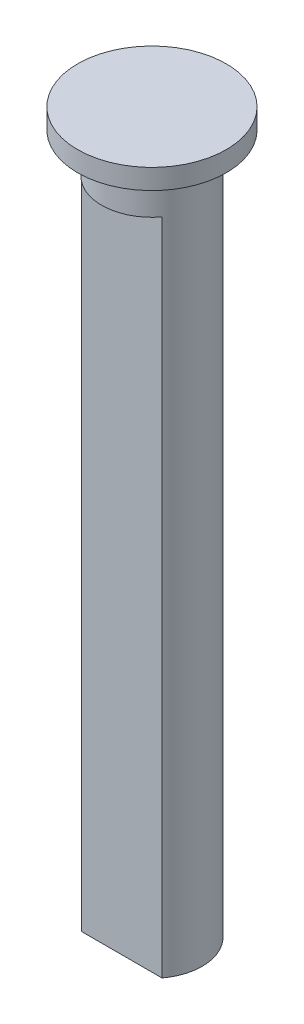
ISO-10303-21;
HEADER;
FILE_DESCRIPTION(('STEP AP214'),'2;1');
FILE_NAME('part.step','',(''),(''),'','','');
FILE_SCHEMA(('AUTOMOTIVE_DESIGN { 1 0 10303 214 1 1 1 1 }'));
ENDSEC;
DATA;
#1=APPLICATION_CONTEXT('core data for automotive mechanical design processes');
#2=APPLICATION_PROTOCOL_DEFINITION('international standard','automotive_design',2000,#1);
#3=PRODUCT_CONTEXT('',#1,'mechanical');
#4=PRODUCT('Part','Part','',(#3));
#5=PRODUCT_RELATED_PRODUCT_CATEGORY('part','',(#4));
#6=PRODUCT_DEFINITION_FORMATION('','',#4);
#7=PRODUCT_DEFINITION_CONTEXT('part definition',#1,'design');
#8=PRODUCT_DEFINITION('design','',#6,#7);
#9=PRODUCT_DEFINITION_SHAPE('','',#8);
#10=(LENGTH_UNIT() NAMED_UNIT(*) SI_UNIT(.MILLI.,.METRE.));
#11=(NAMED_UNIT(*) PLANE_ANGLE_UNIT() SI_UNIT($,.RADIAN.));
#12=(NAMED_UNIT(*) SI_UNIT($,.STERADIAN.) SOLID_ANGLE_UNIT());
#13=UNCERTAINTY_MEASURE_WITH_UNIT(LENGTH_MEASURE(1.E-05),#10,'distance_accuracy_value','');
#14=(GEOMETRIC_REPRESENTATION_CONTEXT(3) GLOBAL_UNCERTAINTY_ASSIGNED_CONTEXT((#13)) GLOBAL_UNIT_ASSIGNED_CONTEXT((#10,
#11,#12)) REPRESENTATION_CONTEXT('',''));
#15=CARTESIAN_POINT('',(0.,0.,0.));
#16=DIRECTION('',(0.,0.,1.));
#17=DIRECTION('',(1.,0.,0.));
#18=AXIS2_PLACEMENT_3D('',#15,#16,#17);
#19=CARTESIAN_POINT('',(0.,27.8,0.));
#20=DIRECTION('',(0.,-1.,0.));
#21=DIRECTION('',(0.,0.,-1.));
#22=AXIS2_PLACEMENT_3D('',#19,#20,#21);
#23=CYLINDRICAL_SURFACE('',#22,2.5);
#24=DIRECTION('',(0.,-1.,0.));
#25=VECTOR('',#24,1.);
#26=CARTESIAN_POINT('',(2.,27.8,1.5));
#27=LINE('',#26,#25);
#28=CARTESIAN_POINT('',(2.,27.8,1.5));
#29=VERTEX_POINT('',#28);
#30=CARTESIAN_POINT('',(2.,-5.,1.5));
#31=VERTEX_POINT('',#30);
#32=EDGE_CURVE('E42',#29,#31,#27,.T.);
#33=ORIENTED_EDGE('',*,*,#32,.T.);
#34=CARTESIAN_POINT('',(0.,-5.,0.));
#35=DIRECTION('',(0.,-1.,0.));
#36=DIRECTION('',(0.,0.,-1.));
#37=AXIS2_PLACEMENT_3D('',#34,#35,#36);
#38=CIRCLE('',#37,2.5);
#39=CARTESIAN_POINT('',(-2.,-5.,1.5));
#40=VERTEX_POINT('',#39);
#41=EDGE_CURVE('E61',#40,#31,#38,.T.);
#42=ORIENTED_EDGE('',*,*,#41,.F.);
#43=DIRECTION('',(0.,-1.,0.));
#44=VECTOR('',#43,1.);
#45=CARTESIAN_POINT('',(-2.,27.8,1.5));
#46=LINE('',#45,#44);
#47=CARTESIAN_POINT('',(-2.,27.8,1.5));
#48=VERTEX_POINT('',#47);
#49=EDGE_CURVE('E11',#48,#40,#46,.T.);
#50=ORIENTED_EDGE('',*,*,#49,.F.);
#51=CARTESIAN_POINT('',(0.,27.8,0.));
#52=DIRECTION('',(0.,1.,0.));
#53=DIRECTION('',(0.,0.,1.));
#54=AXIS2_PLACEMENT_3D('',#51,#52,#53);
#55=CIRCLE('',#54,2.5);
#56=EDGE_CURVE('E63',#48,#29,#55,.T.);
#57=ORIENTED_EDGE('',*,*,#56,.T.);
#58=EDGE_LOOP('',(#33,#42,#50,#57));
#59=FACE_BOUND('',#58,.T.);
#60=CARTESIAN_POINT('',(0.,29.8,0.));
#61=DIRECTION('',(0.,1.,0.));
#62=DIRECTION('',(0.,0.,1.));
#63=AXIS2_PLACEMENT_3D('',#60,#61,#62);
#64=CIRCLE('',#63,2.5);
#65=CARTESIAN_POINT('',(0.,29.8,2.5));
#66=VERTEX_POINT('',#65);
#67=EDGE_CURVE('E78',#66,#66,#64,.T.);
#68=ORIENTED_EDGE('',*,*,#67,.F.);
#69=EDGE_LOOP('',(#68));
#70=FACE_BOUND('',#69,.T.);
#71=ADVANCED_FACE('F35',(#59,#70),#23,.T.);
#72=CARTESIAN_POINT('',(-2.,27.8,1.5));
#73=DIRECTION('',(0.,0.,-1.));
#74=DIRECTION('',(-1.,0.,0.));
#75=AXIS2_PLACEMENT_3D('',#72,#73,#74);
#76=PLANE('',#75);
#77=ORIENTED_EDGE('',*,*,#49,.T.);
#78=DIRECTION('',(-1.,0.,0.));
#79=VECTOR('',#78,1.);
#80=CARTESIAN_POINT('',(-2.,-5.,1.5));
#81=LINE('',#80,#79);
#82=EDGE_CURVE('E65',#31,#40,#81,.T.);
#83=ORIENTED_EDGE('',*,*,#82,.F.);
#84=ORIENTED_EDGE('',*,*,#32,.F.);
#85=DIRECTION('',(1.,0.,0.));
#86=VECTOR('',#85,1.);
#87=CARTESIAN_POINT('',(-2.,27.8,1.5));
#88=LINE('',#87,#86);
#89=EDGE_CURVE('E48',#48,#29,#88,.T.);
#90=ORIENTED_EDGE('',*,*,#89,.F.);
#91=EDGE_LOOP('',(#77,#83,#84,#90));
#92=FACE_BOUND('',#91,.T.);
#93=ADVANCED_FACE('F66',(#92),#76,.F.);
#94=CARTESIAN_POINT('',(0.,27.8,0.));
#95=DIRECTION('',(0.,1.,0.));
#96=DIRECTION('',(0.,0.,1.));
#97=AXIS2_PLACEMENT_3D('',#94,#95,#96);
#98=PLANE('',#97);
#99=ORIENTED_EDGE('',*,*,#56,.F.);
#100=ORIENTED_EDGE('',*,*,#89,.T.);
#101=EDGE_LOOP('',(#99,#100));
#102=FACE_BOUND('',#101,.T.);
#103=ADVANCED_FACE('F83',(#102),#98,.F.);
#104=CARTESIAN_POINT('',(0.,30.8,0.));
#105=DIRECTION('',(0.,-1.,0.));
#106=DIRECTION('',(0.,0.,-1.));
#107=AXIS2_PLACEMENT_3D('',#104,#105,#106);
#108=CYLINDRICAL_SURFACE('',#107,3.7);
#109=CARTESIAN_POINT('',(0.,30.8,0.));
#110=DIRECTION('',(0.,1.,0.));
#111=DIRECTION('',(0.,0.,1.));
#112=AXIS2_PLACEMENT_3D('',#109,#110,#111);
#113=CIRCLE('',#112,3.7);
#114=CARTESIAN_POINT('',(0.,30.8,3.7));
#115=VERTEX_POINT('',#114);
#116=EDGE_CURVE('E73',#115,#115,#113,.T.);
#117=ORIENTED_EDGE('',*,*,#116,.F.);
#118=EDGE_LOOP('',(#117));
#119=FACE_BOUND('',#118,.T.);
#120=CARTESIAN_POINT('',(0.,29.8,0.));
#121=DIRECTION('',(0.,1.,0.));
#122=DIRECTION('',(0.,0.,1.));
#123=AXIS2_PLACEMENT_3D('',#120,#121,#122);
#124=CIRCLE('',#123,3.7);
#125=CARTESIAN_POINT('',(0.,29.8,3.7));
#126=VERTEX_POINT('',#125);
#127=EDGE_CURVE('E68',#126,#126,#124,.T.);
#128=ORIENTED_EDGE('',*,*,#127,.T.);
#129=EDGE_LOOP('',(#128));
#130=FACE_BOUND('',#129,.T.);
#131=ADVANCED_FACE('F85',(#119,#130),#108,.T.);
#132=CARTESIAN_POINT('',(0.,30.8,0.));
#133=DIRECTION('',(0.,1.,0.));
#134=DIRECTION('',(0.,0.,1.));
#135=AXIS2_PLACEMENT_3D('',#132,#133,#134);
#136=PLANE('',#135);
#137=ORIENTED_EDGE('',*,*,#116,.T.);
#138=EDGE_LOOP('',(#137));
#139=FACE_BOUND('',#138,.T.);
#140=ADVANCED_FACE('F91',(#139),#136,.T.);
#141=CARTESIAN_POINT('',(0.,29.8,0.));
#142=DIRECTION('',(0.,1.,0.));
#143=DIRECTION('',(0.,0.,1.));
#144=AXIS2_PLACEMENT_3D('',#141,#142,#143);
#145=PLANE('',#144);
#146=ORIENTED_EDGE('',*,*,#67,.T.);
#147=EDGE_LOOP('',(#146));
#148=FACE_BOUND('',#147,.T.);
#149=ORIENTED_EDGE('',*,*,#127,.F.);
#150=EDGE_LOOP('',(#149));
#151=FACE_BOUND('',#150,.T.);
#152=ADVANCED_FACE('F111',(#148,#151),#145,.F.);
#153=CARTESIAN_POINT('',(0.,-5.,0.));
#154=DIRECTION('',(0.,-1.,0.));
#155=DIRECTION('',(0.,0.,-1.));
#156=AXIS2_PLACEMENT_3D('',#153,#154,#155);
#157=PLANE('',#156);
#158=ORIENTED_EDGE('',*,*,#41,.T.);
#159=ORIENTED_EDGE('',*,*,#82,.T.);
#160=EDGE_LOOP('',(#158,#159));
#161=FACE_BOUND('',#160,.T.);
#162=ADVANCED_FACE('F70',(#161),#157,.T.);
#163=CLOSED_SHELL('',(#71,#93,#103,#131,#140,#152,#162));
#164=MANIFOLD_SOLID_BREP('B2',#163);
#165=ADVANCED_BREP_SHAPE_REPRESENTATION('',(#18,#164),#14);
#166=SHAPE_DEFINITION_REPRESENTATION(#9,#165);
ENDSEC;
END-ISO-10303-21;
